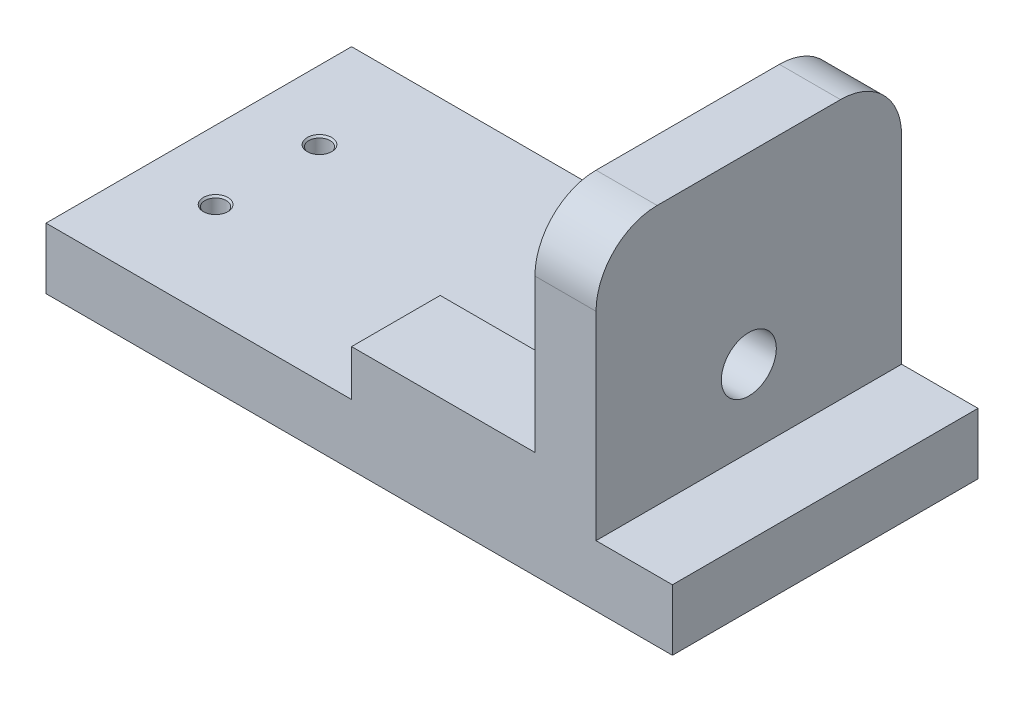
ISO-10303-21;
HEADER;
FILE_DESCRIPTION(('STEP AP214'),'2;1');
FILE_NAME('part.step','',(''),(''),'','','');
FILE_SCHEMA(('AUTOMOTIVE_DESIGN { 1 0 10303 214 1 1 1 1 }'));
ENDSEC;
DATA;
#1=APPLICATION_CONTEXT('core data for automotive mechanical design processes');
#2=APPLICATION_PROTOCOL_DEFINITION('international standard','automotive_design',2000,#1);
#3=PRODUCT_CONTEXT('',#1,'mechanical');
#4=PRODUCT('Part','Part','',(#3));
#5=PRODUCT_RELATED_PRODUCT_CATEGORY('part','',(#4));
#6=PRODUCT_DEFINITION_FORMATION('','',#4);
#7=PRODUCT_DEFINITION_CONTEXT('part definition',#1,'design');
#8=PRODUCT_DEFINITION('design','',#6,#7);
#9=PRODUCT_DEFINITION_SHAPE('','',#8);
#10=(LENGTH_UNIT() NAMED_UNIT(*) SI_UNIT(.MILLI.,.METRE.));
#11=(NAMED_UNIT(*) PLANE_ANGLE_UNIT() SI_UNIT($,.RADIAN.));
#12=(NAMED_UNIT(*) SI_UNIT($,.STERADIAN.) SOLID_ANGLE_UNIT());
#13=UNCERTAINTY_MEASURE_WITH_UNIT(LENGTH_MEASURE(1.E-05),#10,'distance_accuracy_value','');
#14=(GEOMETRIC_REPRESENTATION_CONTEXT(3) GLOBAL_UNCERTAINTY_ASSIGNED_CONTEXT((#13)) GLOBAL_UNIT_ASSIGNED_CONTEXT((#10,
#11,#12)) REPRESENTATION_CONTEXT('',''));
#15=CARTESIAN_POINT('',(0.,0.,0.));
#16=DIRECTION('',(0.,0.,1.));
#17=DIRECTION('',(1.,0.,0.));
#18=AXIS2_PLACEMENT_3D('',#15,#16,#17);
#19=CARTESIAN_POINT('',(-102.5,20.,-50.));
#20=DIRECTION('',(0.,0.,1.));
#21=DIRECTION('',(1.,0.,0.));
#22=AXIS2_PLACEMENT_3D('',#19,#20,#21);
#23=PLANE('',#22);
#24=DIRECTION('',(1.,0.,0.));
#25=VECTOR('',#24,1.);
#26=CARTESIAN_POINT('',(-102.501,84.9999999999999,-50.));
#27=LINE('',#26,#25);
#28=CARTESIAN_POINT('',(57.5,84.9999999999999,-50.));
#29=VERTEX_POINT('',#28);
#30=CARTESIAN_POINT('',(77.5,84.9999999999999,-50.));
#31=VERTEX_POINT('',#30);
#32=EDGE_CURVE('E280',#29,#31,#27,.T.);
#33=ORIENTED_EDGE('',*,*,#32,.T.);
#34=DIRECTION('',(0.,-1.,0.));
#35=VECTOR('',#34,1.);
#36=CARTESIAN_POINT('',(77.5,105.,-50.));
#37=LINE('',#36,#35);
#38=CARTESIAN_POINT('',(77.5,20.,-50.));
#39=VERTEX_POINT('',#38);
#40=EDGE_CURVE('E210',#31,#39,#37,.T.);
#41=ORIENTED_EDGE('',*,*,#40,.T.);
#42=DIRECTION('',(-1.,0.,0.));
#43=VECTOR('',#42,1.);
#44=CARTESIAN_POINT('',(-102.5,20.,-50.));
#45=LINE('',#44,#43);
#46=CARTESIAN_POINT('',(102.5,20.,-50.));
#47=VERTEX_POINT('',#46);
#48=EDGE_CURVE('E220',#47,#39,#45,.T.);
#49=ORIENTED_EDGE('',*,*,#48,.F.);
#50=DIRECTION('',(0.,-1.,0.));
#51=VECTOR('',#50,1.);
#52=CARTESIAN_POINT('',(102.5,20.,-50.));
#53=LINE('',#52,#51);
#54=CARTESIAN_POINT('',(102.5,0.,-50.));
#55=VERTEX_POINT('',#54);
#56=EDGE_CURVE('E11',#47,#55,#53,.T.);
#57=ORIENTED_EDGE('',*,*,#56,.T.);
#58=DIRECTION('',(-1.,0.,0.));
#59=VECTOR('',#58,1.);
#60=CARTESIAN_POINT('',(-102.5,0.,-50.));
#61=LINE('',#60,#59);
#62=CARTESIAN_POINT('',(-102.5,0.,-50.));
#63=VERTEX_POINT('',#62);
#64=EDGE_CURVE('E232',#55,#63,#61,.T.);
#65=ORIENTED_EDGE('',*,*,#64,.T.);
#66=DIRECTION('',(0.,-1.,0.));
#67=VECTOR('',#66,1.);
#68=CARTESIAN_POINT('',(-102.5,20.,-50.));
#69=LINE('',#68,#67);
#70=CARTESIAN_POINT('',(-102.5,20.,-50.));
#71=VERTEX_POINT('',#70);
#72=EDGE_CURVE('E50',#71,#63,#69,.T.);
#73=ORIENTED_EDGE('',*,*,#72,.F.);
#74=CARTESIAN_POINT('',(-2.5,20.,-50.));
#75=VERTEX_POINT('',#74);
#76=EDGE_CURVE('E218',#75,#71,#45,.T.);
#77=ORIENTED_EDGE('',*,*,#76,.F.);
#78=DIRECTION('',(0.,-1.,0.));
#79=VECTOR('',#78,1.);
#80=CARTESIAN_POINT('',(-2.49999999999997,105.,-50.));
#81=LINE('',#80,#79);
#82=CARTESIAN_POINT('',(-2.49999999999996,35.,-50.));
#83=VERTEX_POINT('',#82);
#84=EDGE_CURVE('E208',#83,#75,#81,.T.);
#85=ORIENTED_EDGE('',*,*,#84,.F.);
#86=DIRECTION('',(1.,0.,0.));
#87=VECTOR('',#86,1.);
#88=CARTESIAN_POINT('',(-2.49999999999996,35.,-50.));
#89=LINE('',#88,#87);
#90=CARTESIAN_POINT('',(57.5,35.,-50.));
#91=VERTEX_POINT('',#90);
#92=EDGE_CURVE('E289',#83,#91,#89,.T.);
#93=ORIENTED_EDGE('',*,*,#92,.T.);
#94=DIRECTION('',(0.,1.,0.));
#95=VECTOR('',#94,1.);
#96=CARTESIAN_POINT('',(57.5,105.,-50.));
#97=LINE('',#96,#95);
#98=EDGE_CURVE('E292',#91,#29,#97,.T.);
#99=ORIENTED_EDGE('',*,*,#98,.T.);
#100=EDGE_LOOP('',(#33,#41,#49,#57,#65,#73,#77,#85,#93,#99));
#101=FACE_BOUND('',#100,.T.);
#102=ADVANCED_FACE('F42',(#101),#23,.F.);
#103=CARTESIAN_POINT('',(77.5,105.,0.));
#104=DIRECTION('',(-1.,0.,0.));
#105=DIRECTION('',(0.,0.,1.));
#106=AXIS2_PLACEMENT_3D('',#103,#104,#105);
#107=PLANE('',#106);
#108=DIRECTION('',(0.,0.,-1.));
#109=VECTOR('',#108,1.);
#110=CARTESIAN_POINT('',(77.5,105.,0.));
#111=LINE('',#110,#109);
#112=CARTESIAN_POINT('',(77.5,105.,29.9999999999999));
#113=VERTEX_POINT('',#112);
#114=CARTESIAN_POINT('',(77.5,105.,-29.9999999999999));
#115=VERTEX_POINT('',#114);
#116=EDGE_CURVE('E175',#113,#115,#111,.T.);
#117=ORIENTED_EDGE('',*,*,#116,.F.);
#118=CARTESIAN_POINT('',(77.5,85.,30.));
#119=DIRECTION('',(-1.,0.,0.));
#120=DIRECTION('',(0.,0.,1.));
#121=AXIS2_PLACEMENT_3D('',#118,#119,#120);
#122=CIRCLE('',#121,20.);
#123=CARTESIAN_POINT('',(77.5,85.,50.));
#124=VERTEX_POINT('',#123);
#125=EDGE_CURVE('E57',#124,#113,#122,.T.);
#126=ORIENTED_EDGE('',*,*,#125,.F.);
#127=DIRECTION('',(0.,-1.,0.));
#128=VECTOR('',#127,1.);
#129=CARTESIAN_POINT('',(77.5,105.,50.));
#130=LINE('',#129,#128);
#131=CARTESIAN_POINT('',(77.5,20.,50.));
#132=VERTEX_POINT('',#131);
#133=EDGE_CURVE('E212',#124,#132,#130,.T.);
#134=ORIENTED_EDGE('',*,*,#133,.T.);
#135=DIRECTION('',(0.,0.,-1.));
#136=VECTOR('',#135,1.);
#137=CARTESIAN_POINT('',(77.5,20.,0.));
#138=LINE('',#137,#136);
#139=EDGE_CURVE('E183',#132,#39,#138,.T.);
#140=ORIENTED_EDGE('',*,*,#139,.T.);
#141=ORIENTED_EDGE('',*,*,#40,.F.);
#142=CARTESIAN_POINT('',(77.5,85.,-30.));
#143=DIRECTION('',(-1.,0.,0.));
#144=DIRECTION('',(0.,0.,1.));
#145=AXIS2_PLACEMENT_3D('',#142,#143,#144);
#146=CIRCLE('',#145,20.);
#147=EDGE_CURVE('E277',#115,#31,#146,.T.);
#148=ORIENTED_EDGE('',*,*,#147,.F.);
#149=EDGE_LOOP('',(#117,#126,#134,#140,#141,#148));
#150=FACE_BOUND('',#149,.T.);
#151=CARTESIAN_POINT('',(77.5,45.,0.));
#152=DIRECTION('',(-1.,0.,0.));
#153=DIRECTION('',(0.,0.,1.));
#154=AXIS2_PLACEMENT_3D('',#151,#152,#153);
#155=CIRCLE('',#154,9.);
#156=CARTESIAN_POINT('',(77.5,45.,9.));
#157=VERTEX_POINT('',#156);
#158=EDGE_CURVE('E287',#157,#157,#155,.T.);
#159=ORIENTED_EDGE('',*,*,#158,.T.);
#160=EDGE_LOOP('',(#159));
#161=FACE_BOUND('',#160,.T.);
#162=ADVANCED_FACE('F267',(#150,#161),#107,.F.);
#163=CARTESIAN_POINT('',(57.5,105.,0.));
#164=DIRECTION('',(1.,0.,0.));
#165=DIRECTION('',(0.,0.,-1.));
#166=AXIS2_PLACEMENT_3D('',#163,#164,#165);
#167=PLANE('',#166);
#168=DIRECTION('',(0.,1.,0.));
#169=VECTOR('',#168,1.);
#170=CARTESIAN_POINT('',(57.5,105.,50.));
#171=LINE('',#170,#169);
#172=CARTESIAN_POINT('',(57.5,35.,50.));
#173=VERTEX_POINT('',#172);
#174=CARTESIAN_POINT('',(57.5,85.,50.));
#175=VERTEX_POINT('',#174);
#176=EDGE_CURVE('E170',#173,#175,#171,.T.);
#177=ORIENTED_EDGE('',*,*,#176,.T.);
#178=CARTESIAN_POINT('',(57.5,85.,30.));
#179=DIRECTION('',(1.,0.,0.));
#180=DIRECTION('',(0.,0.,-1.));
#181=AXIS2_PLACEMENT_3D('',#178,#179,#180);
#182=CIRCLE('',#181,20.);
#183=CARTESIAN_POINT('',(57.5,105.,29.9999999999999));
#184=VERTEX_POINT('',#183);
#185=EDGE_CURVE('E155',#184,#175,#182,.T.);
#186=ORIENTED_EDGE('',*,*,#185,.F.);
#187=DIRECTION('',(0.,0.,1.));
#188=VECTOR('',#187,1.);
#189=CARTESIAN_POINT('',(57.5,105.,0.));
#190=LINE('',#189,#188);
#191=CARTESIAN_POINT('',(57.5,105.,-29.9999999999999));
#192=VERTEX_POINT('',#191);
#193=EDGE_CURVE('E168',#192,#184,#190,.T.);
#194=ORIENTED_EDGE('',*,*,#193,.F.);
#195=CARTESIAN_POINT('',(57.5,85.,-30.));
#196=DIRECTION('',(1.,0.,0.));
#197=DIRECTION('',(0.,0.,-1.));
#198=AXIS2_PLACEMENT_3D('',#195,#196,#197);
#199=CIRCLE('',#198,20.);
#200=EDGE_CURVE('E65',#29,#192,#199,.T.);
#201=ORIENTED_EDGE('',*,*,#200,.F.);
#202=ORIENTED_EDGE('',*,*,#98,.F.);
#203=DIRECTION('',(0.,0.,1.));
#204=VECTOR('',#203,1.);
#205=CARTESIAN_POINT('',(57.5,35.,-50.));
#206=LINE('',#205,#204);
#207=CARTESIAN_POINT('',(57.5,35.,-21.));
#208=VERTEX_POINT('',#207);
#209=EDGE_CURVE('E296',#91,#208,#206,.T.);
#210=ORIENTED_EDGE('',*,*,#209,.T.);
#211=DIRECTION('',(0.,-1.,0.));
#212=VECTOR('',#211,1.);
#213=CARTESIAN_POINT('',(57.5,105.,-21.));
#214=LINE('',#213,#212);
#215=CARTESIAN_POINT('',(57.5,20.,-21.));
#216=VERTEX_POINT('',#215);
#217=EDGE_CURVE('E204',#208,#216,#214,.T.);
#218=ORIENTED_EDGE('',*,*,#217,.T.);
#219=DIRECTION('',(0.,0.,1.));
#220=VECTOR('',#219,1.);
#221=CARTESIAN_POINT('',(57.5,20.,0.));
#222=LINE('',#221,#220);
#223=CARTESIAN_POINT('',(57.5,20.,21.));
#224=VERTEX_POINT('',#223);
#225=EDGE_CURVE('E193',#216,#224,#222,.T.);
#226=ORIENTED_EDGE('',*,*,#225,.T.);
#227=DIRECTION('',(0.,-1.,0.));
#228=VECTOR('',#227,1.);
#229=CARTESIAN_POINT('',(57.5,105.,21.));
#230=LINE('',#229,#228);
#231=CARTESIAN_POINT('',(57.5,35.,21.));
#232=VERTEX_POINT('',#231);
#233=EDGE_CURVE('E202',#232,#224,#230,.T.);
#234=ORIENTED_EDGE('',*,*,#233,.F.);
#235=EDGE_CURVE('E300',#232,#173,#206,.T.);
#236=ORIENTED_EDGE('',*,*,#235,.T.);
#237=EDGE_LOOP('',(#177,#186,#194,#201,#202,#210,#218,#226,#234,#236));
#238=FACE_BOUND('',#237,.T.);
#239=CARTESIAN_POINT('',(57.5,45.,0.));
#240=DIRECTION('',(1.,0.,0.));
#241=DIRECTION('',(0.,0.,-1.));
#242=AXIS2_PLACEMENT_3D('',#239,#240,#241);
#243=CIRCLE('',#242,9.);
#244=CARTESIAN_POINT('',(57.5,45.,-9.));
#245=VERTEX_POINT('',#244);
#246=EDGE_CURVE('E274',#245,#245,#243,.T.);
#247=ORIENTED_EDGE('',*,*,#246,.T.);
#248=EDGE_LOOP('',(#247));
#249=FACE_BOUND('',#248,.T.);
#250=ADVANCED_FACE('F166',(#238,#249),#167,.F.);
#251=CARTESIAN_POINT('',(0.,105.,0.));
#252=DIRECTION('',(0.,1.,0.));
#253=DIRECTION('',(0.,0.,1.));
#254=AXIS2_PLACEMENT_3D('',#251,#252,#253);
#255=PLANE('',#254);
#256=DIRECTION('',(1.,0.,0.));
#257=VECTOR('',#256,1.);
#258=CARTESIAN_POINT('',(-102.501,105.,29.9999999999999));
#259=LINE('',#258,#257);
#260=EDGE_CURVE('E152',#184,#113,#259,.T.);
#261=ORIENTED_EDGE('',*,*,#260,.T.);
#262=ORIENTED_EDGE('',*,*,#116,.T.);
#263=DIRECTION('',(1.,0.,0.));
#264=VECTOR('',#263,1.);
#265=CARTESIAN_POINT('',(-102.501,105.,-29.9999999999999));
#266=LINE('',#265,#264);
#267=EDGE_CURVE('E171',#192,#115,#266,.T.);
#268=ORIENTED_EDGE('',*,*,#267,.F.);
#269=ORIENTED_EDGE('',*,*,#193,.T.);
#270=EDGE_LOOP('',(#261,#262,#268,#269));
#271=FACE_BOUND('',#270,.T.);
#272=ADVANCED_FACE('F173',(#271),#255,.T.);
#273=CARTESIAN_POINT('',(0.,20.,0.));
#274=DIRECTION('',(0.,-1.,0.));
#275=DIRECTION('',(0.,0.,-1.));
#276=AXIS2_PLACEMENT_3D('',#273,#274,#275);
#277=PLANE('',#276);
#278=CARTESIAN_POINT('',(-80.,20.,17.));
#279=DIRECTION('',(0.,1.,0.));
#280=DIRECTION('',(0.,0.,1.));
#281=AXIS2_PLACEMENT_3D('',#278,#279,#280);
#282=CIRCLE('',#281,4.025);
#283=CARTESIAN_POINT('',(-80.,20.,21.025));
#284=VERTEX_POINT('',#283);
#285=EDGE_CURVE('E402',#284,#284,#282,.T.);
#286=ORIENTED_EDGE('',*,*,#285,.F.);
#287=EDGE_LOOP('',(#286));
#288=FACE_BOUND('',#287,.T.);
#289=CARTESIAN_POINT('',(-80.,20.,-17.));
#290=DIRECTION('',(0.,1.,0.));
#291=DIRECTION('',(0.,0.,1.));
#292=AXIS2_PLACEMENT_3D('',#289,#290,#291);
#293=CIRCLE('',#292,4.025);
#294=CARTESIAN_POINT('',(-80.,20.,-12.975));
#295=VERTEX_POINT('',#294);
#296=EDGE_CURVE('E409',#295,#295,#293,.T.);
#297=ORIENTED_EDGE('',*,*,#296,.F.);
#298=EDGE_LOOP('',(#297));
#299=FACE_BOUND('',#298,.T.);
#300=DIRECTION('',(0.,0.,1.));
#301=VECTOR('',#300,1.);
#302=CARTESIAN_POINT('',(-2.49999999999997,20.,0.));
#303=LINE('',#302,#301);
#304=CARTESIAN_POINT('',(-2.49999999999997,20.,21.));
#305=VERTEX_POINT('',#304);
#306=CARTESIAN_POINT('',(-2.5,20.,50.));
#307=VERTEX_POINT('',#306);
#308=EDGE_CURVE('E179',#305,#307,#303,.T.);
#309=ORIENTED_EDGE('',*,*,#308,.F.);
#310=DIRECTION('',(-1.,0.,0.));
#311=VECTOR('',#310,1.);
#312=CARTESIAN_POINT('',(0.,20.,21.));
#313=LINE('',#312,#311);
#314=EDGE_CURVE('E196',#224,#305,#313,.T.);
#315=ORIENTED_EDGE('',*,*,#314,.F.);
#316=ORIENTED_EDGE('',*,*,#225,.F.);
#317=DIRECTION('',(1.,0.,0.));
#318=VECTOR('',#317,1.);
#319=CARTESIAN_POINT('',(0.,20.,-21.));
#320=LINE('',#319,#318);
#321=CARTESIAN_POINT('',(-2.49999999999997,20.,-21.));
#322=VERTEX_POINT('',#321);
#323=EDGE_CURVE('E190',#322,#216,#320,.T.);
#324=ORIENTED_EDGE('',*,*,#323,.F.);
#325=DIRECTION('',(0.,0.,1.));
#326=VECTOR('',#325,1.);
#327=CARTESIAN_POINT('',(-2.49999999999997,20.,0.));
#328=LINE('',#327,#326);
#329=EDGE_CURVE('E186',#75,#322,#328,.T.);
#330=ORIENTED_EDGE('',*,*,#329,.F.);
#331=ORIENTED_EDGE('',*,*,#76,.T.);
#332=DIRECTION('',(0.,0.,1.));
#333=VECTOR('',#332,1.);
#334=CARTESIAN_POINT('',(-102.5,20.,50.));
#335=LINE('',#334,#333);
#336=CARTESIAN_POINT('',(-102.5,20.,50.));
#337=VERTEX_POINT('',#336);
#338=EDGE_CURVE('E223',#71,#337,#335,.T.);
#339=ORIENTED_EDGE('',*,*,#338,.T.);
#340=DIRECTION('',(1.,0.,0.));
#341=VECTOR('',#340,1.);
#342=CARTESIAN_POINT('',(-102.5,20.,50.));
#343=LINE('',#342,#341);
#344=EDGE_CURVE('E226',#337,#307,#343,.T.);
#345=ORIENTED_EDGE('',*,*,#344,.T.);
#346=EDGE_LOOP('',(#309,#315,#316,#324,#330,#331,#339,#345));
#347=FACE_BOUND('',#346,.T.);
#348=ADVANCED_FACE('F318',(#288,#299,#347),#277,.F.);
#349=ORIENTED_EDGE('',*,*,#139,.F.);
#350=CARTESIAN_POINT('',(102.5,20.,50.));
#351=VERTEX_POINT('',#350);
#352=EDGE_CURVE('E225',#132,#351,#343,.T.);
#353=ORIENTED_EDGE('',*,*,#352,.T.);
#354=DIRECTION('',(0.,0.,-1.));
#355=VECTOR('',#354,1.);
#356=CARTESIAN_POINT('',(102.5,20.,50.));
#357=LINE('',#356,#355);
#358=EDGE_CURVE('E215',#351,#47,#357,.T.);
#359=ORIENTED_EDGE('',*,*,#358,.T.);
#360=ORIENTED_EDGE('',*,*,#48,.T.);
#361=EDGE_LOOP('',(#349,#353,#359,#360));
#362=FACE_BOUND('',#361,.T.);
#363=ADVANCED_FACE('F265',(#362),#277,.F.);
#364=CARTESIAN_POINT('',(102.5,20.,50.));
#365=DIRECTION('',(-1.,0.,0.));
#366=DIRECTION('',(0.,0.,1.));
#367=AXIS2_PLACEMENT_3D('',#364,#365,#366);
#368=PLANE('',#367);
#369=DIRECTION('',(0.,0.,-1.));
#370=VECTOR('',#369,1.);
#371=CARTESIAN_POINT('',(102.5,0.,50.));
#372=LINE('',#371,#370);
#373=CARTESIAN_POINT('',(102.5,0.,50.));
#374=VERTEX_POINT('',#373);
#375=EDGE_CURVE('E214',#374,#55,#372,.T.);
#376=ORIENTED_EDGE('',*,*,#375,.T.);
#377=ORIENTED_EDGE('',*,*,#56,.F.);
#378=ORIENTED_EDGE('',*,*,#358,.F.);
#379=DIRECTION('',(0.,-1.,0.));
#380=VECTOR('',#379,1.);
#381=CARTESIAN_POINT('',(102.5,20.,50.));
#382=LINE('',#381,#380);
#383=EDGE_CURVE('E229',#351,#374,#382,.T.);
#384=ORIENTED_EDGE('',*,*,#383,.T.);
#385=EDGE_LOOP('',(#376,#377,#378,#384));
#386=FACE_BOUND('',#385,.T.);
#387=ADVANCED_FACE('F44',(#386),#368,.F.);
#388=CARTESIAN_POINT('',(-102.5,20.,50.));
#389=DIRECTION('',(1.,0.,0.));
#390=DIRECTION('',(0.,0.,-1.));
#391=AXIS2_PLACEMENT_3D('',#388,#389,#390);
#392=PLANE('',#391);
#393=DIRECTION('',(0.,0.,1.));
#394=VECTOR('',#393,1.);
#395=CARTESIAN_POINT('',(-102.5,0.,50.));
#396=LINE('',#395,#394);
#397=CARTESIAN_POINT('',(-102.5,0.,50.));
#398=VERTEX_POINT('',#397);
#399=EDGE_CURVE('E234',#63,#398,#396,.T.);
#400=ORIENTED_EDGE('',*,*,#399,.T.);
#401=DIRECTION('',(0.,-1.,0.));
#402=VECTOR('',#401,1.);
#403=CARTESIAN_POINT('',(-102.5,20.,50.));
#404=LINE('',#403,#402);
#405=EDGE_CURVE('E239',#337,#398,#404,.T.);
#406=ORIENTED_EDGE('',*,*,#405,.F.);
#407=ORIENTED_EDGE('',*,*,#338,.F.);
#408=ORIENTED_EDGE('',*,*,#72,.T.);
#409=EDGE_LOOP('',(#400,#406,#407,#408));
#410=FACE_BOUND('',#409,.T.);
#411=ADVANCED_FACE('F246',(#410),#392,.F.);
#412=CARTESIAN_POINT('',(-102.5,20.,50.));
#413=DIRECTION('',(0.,0.,-1.));
#414=DIRECTION('',(-1.,0.,0.));
#415=AXIS2_PLACEMENT_3D('',#412,#413,#414);
#416=PLANE('',#415);
#417=ORIENTED_EDGE('',*,*,#133,.F.);
#418=DIRECTION('',(1.,0.,0.));
#419=VECTOR('',#418,1.);
#420=CARTESIAN_POINT('',(-102.501,85.,50.));
#421=LINE('',#420,#419);
#422=EDGE_CURVE('E161',#175,#124,#421,.T.);
#423=ORIENTED_EDGE('',*,*,#422,.F.);
#424=ORIENTED_EDGE('',*,*,#176,.F.);
#425=DIRECTION('',(1.,0.,0.));
#426=VECTOR('',#425,1.);
#427=CARTESIAN_POINT('',(-2.49999999999996,35.,50.));
#428=LINE('',#427,#426);
#429=CARTESIAN_POINT('',(-2.49999999999996,35.,50.));
#430=VERTEX_POINT('',#429);
#431=EDGE_CURVE('E284',#430,#173,#428,.T.);
#432=ORIENTED_EDGE('',*,*,#431,.F.);
#433=DIRECTION('',(0.,-1.,0.));
#434=VECTOR('',#433,1.);
#435=CARTESIAN_POINT('',(-2.49999999999997,105.,50.));
#436=LINE('',#435,#434);
#437=EDGE_CURVE('E174',#430,#307,#436,.T.);
#438=ORIENTED_EDGE('',*,*,#437,.T.);
#439=ORIENTED_EDGE('',*,*,#344,.F.);
#440=ORIENTED_EDGE('',*,*,#405,.T.);
#441=DIRECTION('',(1.,0.,0.));
#442=VECTOR('',#441,1.);
#443=CARTESIAN_POINT('',(-102.5,0.,50.));
#444=LINE('',#443,#442);
#445=EDGE_CURVE('E219',#398,#374,#444,.T.);
#446=ORIENTED_EDGE('',*,*,#445,.T.);
#447=ORIENTED_EDGE('',*,*,#383,.F.);
#448=ORIENTED_EDGE('',*,*,#352,.F.);
#449=EDGE_LOOP('',(#417,#423,#424,#432,#438,#439,#440,#446,#447,#448));
#450=FACE_BOUND('',#449,.T.);
#451=ADVANCED_FACE('F257',(#450),#416,.F.);
#452=CARTESIAN_POINT('',(0.,0.,0.));
#453=DIRECTION('',(0.,-1.,0.));
#454=DIRECTION('',(0.,0.,-1.));
#455=AXIS2_PLACEMENT_3D('',#452,#453,#454);
#456=PLANE('',#455);
#457=CARTESIAN_POINT('',(-80.,0.,17.));
#458=DIRECTION('',(0.,1.,0.));
#459=DIRECTION('',(0.,0.,1.));
#460=AXIS2_PLACEMENT_3D('',#457,#458,#459);
#461=CIRCLE('',#460,3.5);
#462=CARTESIAN_POINT('',(-80.,0.,20.5));
#463=VERTEX_POINT('',#462);
#464=EDGE_CURVE('E404',#463,#463,#461,.T.);
#465=ORIENTED_EDGE('',*,*,#464,.T.);
#466=EDGE_LOOP('',(#465));
#467=FACE_BOUND('',#466,.T.);
#468=CARTESIAN_POINT('',(-80.,0.,-17.));
#469=DIRECTION('',(0.,1.,0.));
#470=DIRECTION('',(0.,0.,1.));
#471=AXIS2_PLACEMENT_3D('',#468,#469,#470);
#472=CIRCLE('',#471,3.5);
#473=CARTESIAN_POINT('',(-80.,0.,-13.5));
#474=VERTEX_POINT('',#473);
#475=EDGE_CURVE('E278',#474,#474,#472,.T.);
#476=ORIENTED_EDGE('',*,*,#475,.T.);
#477=EDGE_LOOP('',(#476));
#478=FACE_BOUND('',#477,.T.);
#479=ORIENTED_EDGE('',*,*,#375,.F.);
#480=ORIENTED_EDGE('',*,*,#445,.F.);
#481=ORIENTED_EDGE('',*,*,#399,.F.);
#482=ORIENTED_EDGE('',*,*,#64,.F.);
#483=EDGE_LOOP('',(#479,#480,#481,#482));
#484=FACE_BOUND('',#483,.T.);
#485=ADVANCED_FACE('F253',(#467,#478,#484),#456,.T.);
#486=CARTESIAN_POINT('',(-2.49999999999997,105.,0.));
#487=DIRECTION('',(1.,0.,0.));
#488=DIRECTION('',(0.,0.,-1.));
#489=AXIS2_PLACEMENT_3D('',#486,#487,#488);
#490=PLANE('',#489);
#491=DIRECTION('',(0.,-1.,0.));
#492=VECTOR('',#491,1.);
#493=CARTESIAN_POINT('',(-2.49999999999997,105.,-21.));
#494=LINE('',#493,#492);
#495=CARTESIAN_POINT('',(-2.49999999999996,35.,-21.));
#496=VERTEX_POINT('',#495);
#497=EDGE_CURVE('E206',#496,#322,#494,.T.);
#498=ORIENTED_EDGE('',*,*,#497,.F.);
#499=DIRECTION('',(0.,0.,1.));
#500=VECTOR('',#499,1.);
#501=CARTESIAN_POINT('',(-2.49999999999996,35.,-50.));
#502=LINE('',#501,#500);
#503=EDGE_CURVE('E301',#83,#496,#502,.T.);
#504=ORIENTED_EDGE('',*,*,#503,.F.);
#505=ORIENTED_EDGE('',*,*,#84,.T.);
#506=ORIENTED_EDGE('',*,*,#329,.T.);
#507=EDGE_LOOP('',(#498,#504,#505,#506));
#508=FACE_BOUND('',#507,.T.);
#509=ADVANCED_FACE('F313',(#508),#490,.F.);
#510=CARTESIAN_POINT('',(0.,105.,-21.));
#511=DIRECTION('',(0.,0.,-1.));
#512=DIRECTION('',(-1.,0.,0.));
#513=AXIS2_PLACEMENT_3D('',#510,#511,#512);
#514=PLANE('',#513);
#515=ORIENTED_EDGE('',*,*,#217,.F.);
#516=DIRECTION('',(-1.,0.,0.));
#517=VECTOR('',#516,1.);
#518=CARTESIAN_POINT('',(0.,35.,-21.));
#519=LINE('',#518,#517);
#520=EDGE_CURVE('E187',#208,#496,#519,.T.);
#521=ORIENTED_EDGE('',*,*,#520,.T.);
#522=ORIENTED_EDGE('',*,*,#497,.T.);
#523=ORIENTED_EDGE('',*,*,#323,.T.);
#524=EDGE_LOOP('',(#515,#521,#522,#523));
#525=FACE_BOUND('',#524,.T.);
#526=ADVANCED_FACE('F308',(#525),#514,.F.);
#527=CARTESIAN_POINT('',(0.,105.,21.));
#528=DIRECTION('',(0.,0.,1.));
#529=DIRECTION('',(1.,0.,0.));
#530=AXIS2_PLACEMENT_3D('',#527,#528,#529);
#531=PLANE('',#530);
#532=DIRECTION('',(0.,-1.,0.));
#533=VECTOR('',#532,1.);
#534=CARTESIAN_POINT('',(-2.49999999999997,105.,21.));
#535=LINE('',#534,#533);
#536=CARTESIAN_POINT('',(-2.49999999999996,35.,21.));
#537=VERTEX_POINT('',#536);
#538=EDGE_CURVE('E177',#537,#305,#535,.T.);
#539=ORIENTED_EDGE('',*,*,#538,.F.);
#540=DIRECTION('',(1.,0.,0.));
#541=VECTOR('',#540,1.);
#542=CARTESIAN_POINT('',(0.,35.,21.));
#543=LINE('',#542,#541);
#544=EDGE_CURVE('E299',#537,#232,#543,.T.);
#545=ORIENTED_EDGE('',*,*,#544,.T.);
#546=ORIENTED_EDGE('',*,*,#233,.T.);
#547=ORIENTED_EDGE('',*,*,#314,.T.);
#548=EDGE_LOOP('',(#539,#545,#546,#547));
#549=FACE_BOUND('',#548,.T.);
#550=ADVANCED_FACE('F326',(#549),#531,.F.);
#551=CARTESIAN_POINT('',(-2.49999999999997,105.,0.));
#552=DIRECTION('',(1.,0.,0.));
#553=DIRECTION('',(0.,0.,-1.));
#554=AXIS2_PLACEMENT_3D('',#551,#552,#553);
#555=PLANE('',#554);
#556=ORIENTED_EDGE('',*,*,#437,.F.);
#557=EDGE_CURVE('E295',#537,#430,#502,.T.);
#558=ORIENTED_EDGE('',*,*,#557,.F.);
#559=ORIENTED_EDGE('',*,*,#538,.T.);
#560=ORIENTED_EDGE('',*,*,#308,.T.);
#561=EDGE_LOOP('',(#556,#558,#559,#560));
#562=FACE_BOUND('',#561,.T.);
#563=ADVANCED_FACE('F333',(#562),#555,.F.);
#564=CARTESIAN_POINT('',(-2.49999999999996,35.,-50.));
#565=DIRECTION('',(0.,-1.,0.));
#566=DIRECTION('',(0.,0.,-1.));
#567=AXIS2_PLACEMENT_3D('',#564,#565,#566);
#568=PLANE('',#567);
#569=ORIENTED_EDGE('',*,*,#209,.F.);
#570=ORIENTED_EDGE('',*,*,#92,.F.);
#571=ORIENTED_EDGE('',*,*,#503,.T.);
#572=ORIENTED_EDGE('',*,*,#520,.F.);
#573=EDGE_LOOP('',(#569,#570,#571,#572));
#574=FACE_BOUND('',#573,.T.);
#575=ADVANCED_FACE('F321',(#574),#568,.F.);
#576=ORIENTED_EDGE('',*,*,#557,.T.);
#577=ORIENTED_EDGE('',*,*,#431,.T.);
#578=ORIENTED_EDGE('',*,*,#235,.F.);
#579=ORIENTED_EDGE('',*,*,#544,.F.);
#580=EDGE_LOOP('',(#576,#577,#578,#579));
#581=FACE_BOUND('',#580,.T.);
#582=ADVANCED_FACE('F329',(#581),#568,.F.);
#583=CARTESIAN_POINT('',(-102.501,85.,-30.));
#584=DIRECTION('',(1.,0.,0.));
#585=DIRECTION('',(0.,0.,-1.));
#586=AXIS2_PLACEMENT_3D('',#583,#584,#585);
#587=CYLINDRICAL_SURFACE('',#586,20.);
#588=ORIENTED_EDGE('',*,*,#200,.T.);
#589=ORIENTED_EDGE('',*,*,#267,.T.);
#590=ORIENTED_EDGE('',*,*,#147,.T.);
#591=ORIENTED_EDGE('',*,*,#32,.F.);
#592=EDGE_LOOP('',(#588,#589,#590,#591));
#593=FACE_BOUND('',#592,.T.);
#594=ADVANCED_FACE('F370',(#593),#587,.T.);
#595=CARTESIAN_POINT('',(-102.501,85.,30.));
#596=DIRECTION('',(1.,0.,0.));
#597=DIRECTION('',(0.,0.,-1.));
#598=AXIS2_PLACEMENT_3D('',#595,#596,#597);
#599=CYLINDRICAL_SURFACE('',#598,20.);
#600=ORIENTED_EDGE('',*,*,#185,.T.);
#601=ORIENTED_EDGE('',*,*,#422,.T.);
#602=ORIENTED_EDGE('',*,*,#125,.T.);
#603=ORIENTED_EDGE('',*,*,#260,.F.);
#604=EDGE_LOOP('',(#600,#601,#602,#603));
#605=FACE_BOUND('',#604,.T.);
#606=ADVANCED_FACE('F154',(#605),#599,.T.);
#607=CARTESIAN_POINT('',(-102.501,45.,0.));
#608=DIRECTION('',(1.,0.,0.));
#609=DIRECTION('',(0.,0.,-1.));
#610=AXIS2_PLACEMENT_3D('',#607,#608,#609);
#611=CYLINDRICAL_SURFACE('',#610,9.);
#612=ORIENTED_EDGE('',*,*,#158,.F.);
#613=EDGE_LOOP('',(#612));
#614=FACE_BOUND('',#613,.T.);
#615=ORIENTED_EDGE('',*,*,#246,.F.);
#616=EDGE_LOOP('',(#615));
#617=FACE_BOUND('',#616,.T.);
#618=ADVANCED_FACE('F375',(#614,#617),#611,.F.);
#619=CARTESIAN_POINT('',(-80.,20.,-17.));
#620=DIRECTION('',(0.,1.,0.));
#621=DIRECTION('',(0.,0.,1.));
#622=AXIS2_PLACEMENT_3D('',#619,#620,#621);
#623=CYLINDRICAL_SURFACE('',#622,3.5);
#624=ORIENTED_EDGE('',*,*,#475,.F.);
#625=EDGE_LOOP('',(#624));
#626=FACE_BOUND('',#625,.T.);
#627=CARTESIAN_POINT('',(-80.,19.396056586209,-17.));
#628=DIRECTION('',(0.,1.,0.));
#629=DIRECTION('',(0.,0.,1.));
#630=AXIS2_PLACEMENT_3D('',#627,#628,#629);
#631=CIRCLE('',#630,3.5);
#632=CARTESIAN_POINT('',(-80.,19.396056586209,-13.5));
#633=VERTEX_POINT('',#632);
#634=EDGE_CURVE('E412',#633,#633,#631,.T.);
#635=ORIENTED_EDGE('',*,*,#634,.T.);
#636=EDGE_LOOP('',(#635));
#637=FACE_BOUND('',#636,.T.);
#638=ADVANCED_FACE('F378',(#626,#637),#623,.F.);
#639=CARTESIAN_POINT('',(-80.,20.,-17.));
#640=DIRECTION('',(0.,1.,0.));
#641=DIRECTION('',(0.,0.,1.));
#642=AXIS2_PLACEMENT_3D('',#639,#640,#641);
#643=CONICAL_SURFACE('',#642,4.025,0.715584993317674);
#644=ORIENTED_EDGE('',*,*,#634,.F.);
#645=EDGE_LOOP('',(#644));
#646=FACE_BOUND('',#645,.T.);
#647=ORIENTED_EDGE('',*,*,#296,.T.);
#648=EDGE_LOOP('',(#647));
#649=FACE_BOUND('',#648,.T.);
#650=ADVANCED_FACE('F382',(#646,#649),#643,.F.);
#651=CARTESIAN_POINT('',(-80.,20.,17.));
#652=DIRECTION('',(0.,1.,0.));
#653=DIRECTION('',(0.,0.,1.));
#654=AXIS2_PLACEMENT_3D('',#651,#652,#653);
#655=CYLINDRICAL_SURFACE('',#654,3.5);
#656=ORIENTED_EDGE('',*,*,#464,.F.);
#657=EDGE_LOOP('',(#656));
#658=FACE_BOUND('',#657,.T.);
#659=CARTESIAN_POINT('',(-80.,19.396056586209,17.));
#660=DIRECTION('',(0.,1.,0.));
#661=DIRECTION('',(0.,0.,1.));
#662=AXIS2_PLACEMENT_3D('',#659,#660,#661);
#663=CIRCLE('',#662,3.5);
#664=CARTESIAN_POINT('',(-80.,19.396056586209,20.5));
#665=VERTEX_POINT('',#664);
#666=EDGE_CURVE('E399',#665,#665,#663,.T.);
#667=ORIENTED_EDGE('',*,*,#666,.T.);
#668=EDGE_LOOP('',(#667));
#669=FACE_BOUND('',#668,.T.);
#670=ADVANCED_FACE('F386',(#658,#669),#655,.F.);
#671=CARTESIAN_POINT('',(-80.,20.,17.));
#672=DIRECTION('',(0.,1.,0.));
#673=DIRECTION('',(0.,0.,1.));
#674=AXIS2_PLACEMENT_3D('',#671,#672,#673);
#675=CONICAL_SURFACE('',#674,4.025,0.715584993317674);
#676=ORIENTED_EDGE('',*,*,#666,.F.);
#677=EDGE_LOOP('',(#676));
#678=FACE_BOUND('',#677,.T.);
#679=ORIENTED_EDGE('',*,*,#285,.T.);
#680=EDGE_LOOP('',(#679));
#681=FACE_BOUND('',#680,.T.);
#682=ADVANCED_FACE('F390',(#678,#681),#675,.F.);
#683=CLOSED_SHELL('',(#102,#162,#250,#272,#348,#363,#387,#411,#451,#485,#509,#526,#550,#563,
#575,#582,#594,#606,#618,#638,#650,#670,#682));
#684=MANIFOLD_SOLID_BREP('B2',#683);
#685=ADVANCED_BREP_SHAPE_REPRESENTATION('',(#18,#684),#14);
#686=SHAPE_DEFINITION_REPRESENTATION(#9,#685);
ENDSEC;
END-ISO-10303-21;
